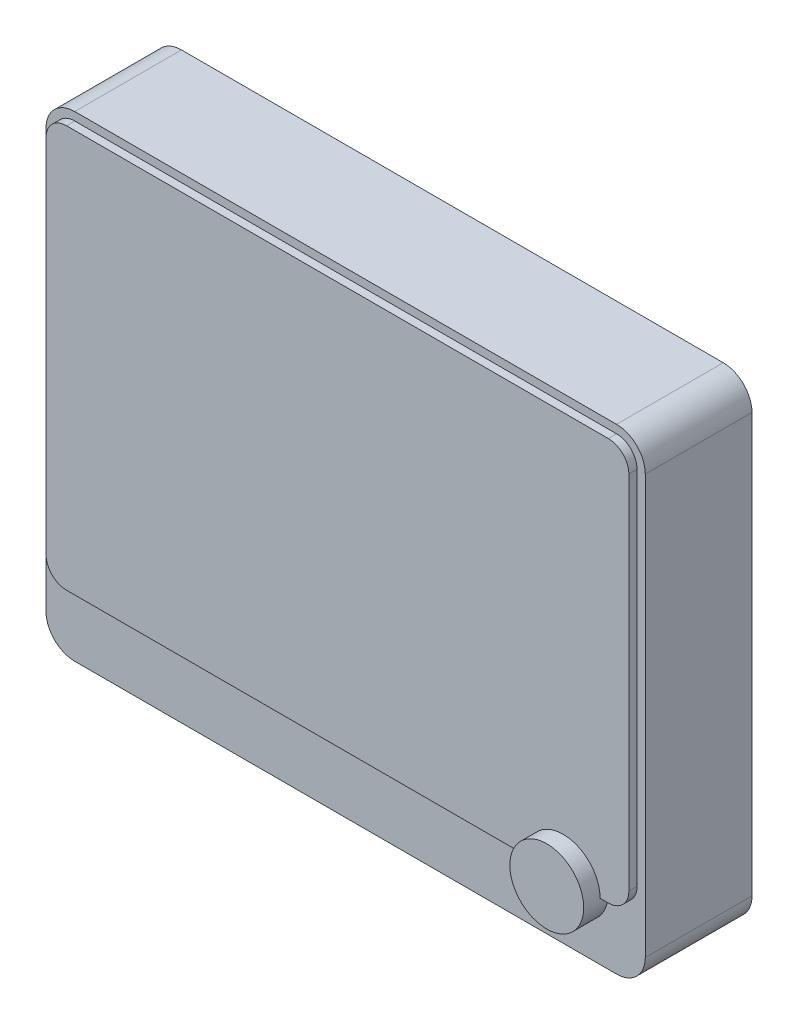
ISO-10303-21;
HEADER;
FILE_DESCRIPTION(('STEP AP214'),'2;1');
FILE_NAME('part.step','',(''),(''),'','','');
FILE_SCHEMA(('AUTOMOTIVE_DESIGN { 1 0 10303 214 1 1 1 1 }'));
ENDSEC;
DATA;
#1=APPLICATION_CONTEXT('core data for automotive mechanical design processes');
#2=APPLICATION_PROTOCOL_DEFINITION('international standard','automotive_design',2000,#1);
#3=PRODUCT_CONTEXT('',#1,'mechanical');
#4=PRODUCT('Part','Part','',(#3));
#5=PRODUCT_RELATED_PRODUCT_CATEGORY('part','',(#4));
#6=PRODUCT_DEFINITION_FORMATION('','',#4);
#7=PRODUCT_DEFINITION_CONTEXT('part definition',#1,'design');
#8=PRODUCT_DEFINITION('design','',#6,#7);
#9=PRODUCT_DEFINITION_SHAPE('','',#8);
#10=(LENGTH_UNIT() NAMED_UNIT(*) SI_UNIT(.MILLI.,.METRE.));
#11=(NAMED_UNIT(*) PLANE_ANGLE_UNIT() SI_UNIT($,.RADIAN.));
#12=(NAMED_UNIT(*) SI_UNIT($,.STERADIAN.) SOLID_ANGLE_UNIT());
#13=UNCERTAINTY_MEASURE_WITH_UNIT(LENGTH_MEASURE(1.E-05),#10,'distance_accuracy_value','');
#14=(GEOMETRIC_REPRESENTATION_CONTEXT(3) GLOBAL_UNCERTAINTY_ASSIGNED_CONTEXT((#13)) GLOBAL_UNIT_ASSIGNED_CONTEXT((#10,
#11,#12)) REPRESENTATION_CONTEXT('',''));
#15=CARTESIAN_POINT('',(0.,0.,0.));
#16=DIRECTION('',(0.,0.,1.));
#17=DIRECTION('',(1.,0.,0.));
#18=AXIS2_PLACEMENT_3D('',#15,#16,#17);
#19=CARTESIAN_POINT('',(3.5,8.,14.));
#20=DIRECTION('',(0.,1.,0.));
#21=DIRECTION('',(0.,0.,1.));
#22=AXIS2_PLACEMENT_3D('',#19,#20,#21);
#23=PLANE('',#22);
#24=DIRECTION('',(0.,0.,-1.));
#25=VECTOR('',#24,1.);
#26=CARTESIAN_POINT('',(68.5,8.,16.));
#27=LINE('',#26,#25);
#28=CARTESIAN_POINT('',(68.5,8.,13.));
#29=VERTEX_POINT('',#28);
#30=CARTESIAN_POINT('',(68.5,8.,14.));
#31=VERTEX_POINT('',#30);
#32=EDGE_CURVE('E56',#29,#31,#27,.F.);
#33=ORIENTED_EDGE('',*,*,#32,.F.);
#34=DIRECTION('',(1.,0.,0.));
#35=VECTOR('',#34,1.);
#36=CARTESIAN_POINT('',(3.5,8.,13.));
#37=LINE('',#36,#35);
#38=CARTESIAN_POINT('',(69.5,8.00000000000001,13.));
#39=VERTEX_POINT('',#38);
#40=EDGE_CURVE('E251',#29,#39,#37,.T.);
#41=ORIENTED_EDGE('',*,*,#40,.T.);
#42=DIRECTION('',(0.,0.,-1.));
#43=VECTOR('',#42,1.);
#44=CARTESIAN_POINT('',(69.5,8.00000000000001,14.));
#45=LINE('',#44,#43);
#46=CARTESIAN_POINT('',(69.5,8.00000000000001,14.));
#47=VERTEX_POINT('',#46);
#48=EDGE_CURVE('E283',#47,#39,#45,.T.);
#49=ORIENTED_EDGE('',*,*,#48,.F.);
#50=DIRECTION('',(1.,0.,0.));
#51=VECTOR('',#50,1.);
#52=CARTESIAN_POINT('',(3.5,8.,14.));
#53=LINE('',#52,#51);
#54=EDGE_CURVE('E231',#31,#47,#53,.T.);
#55=ORIENTED_EDGE('',*,*,#54,.F.);
#56=EDGE_LOOP('',(#33,#41,#49,#55));
#57=FACE_BOUND('',#56,.T.);
#58=ADVANCED_FACE('F33',(#57),#23,.F.);
#59=DIRECTION('',(0.,0.,-1.));
#60=VECTOR('',#59,1.);
#61=CARTESIAN_POINT('',(59.5,8.,16.));
#62=LINE('',#61,#60);
#63=CARTESIAN_POINT('',(59.5,8.,14.));
#64=VERTEX_POINT('',#63);
#65=CARTESIAN_POINT('',(59.5,8.,13.));
#66=VERTEX_POINT('',#65);
#67=EDGE_CURVE('E223',#64,#66,#62,.T.);
#68=ORIENTED_EDGE('',*,*,#67,.F.);
#69=CARTESIAN_POINT('',(3.5,8.,14.));
#70=VERTEX_POINT('',#69);
#71=EDGE_CURVE('E233',#70,#64,#53,.T.);
#72=ORIENTED_EDGE('',*,*,#71,.F.);
#73=DIRECTION('',(0.,0.,-1.));
#74=VECTOR('',#73,1.);
#75=CARTESIAN_POINT('',(3.5,8.,14.));
#76=LINE('',#75,#74);
#77=CARTESIAN_POINT('',(3.5,8.,13.));
#78=VERTEX_POINT('',#77);
#79=EDGE_CURVE('E286',#70,#78,#76,.T.);
#80=ORIENTED_EDGE('',*,*,#79,.T.);
#81=EDGE_CURVE('E252',#78,#66,#37,.T.);
#82=ORIENTED_EDGE('',*,*,#81,.T.);
#83=EDGE_LOOP('',(#68,#72,#80,#82));
#84=FACE_BOUND('',#83,.T.);
#85=ADVANCED_FACE('F395',(#84),#23,.F.);
#86=CARTESIAN_POINT('',(0.,0.,13.));
#87=DIRECTION('',(0.,0.,1.));
#88=DIRECTION('',(1.,0.,0.));
#89=AXIS2_PLACEMENT_3D('',#86,#87,#88);
#90=PLANE('',#89);
#91=DIRECTION('',(1.,0.,0.));
#92=VECTOR('',#91,1.);
#93=CARTESIAN_POINT('',(0.,0.,13.));
#94=LINE('',#93,#92);
#95=CARTESIAN_POINT('',(3.5,0.,13.));
#96=VERTEX_POINT('',#95);
#97=CARTESIAN_POINT('',(69.5,0.,13.));
#98=VERTEX_POINT('',#97);
#99=EDGE_CURVE('E292',#96,#98,#94,.T.);
#100=ORIENTED_EDGE('',*,*,#99,.T.);
#101=CARTESIAN_POINT('',(69.5,3.5,13.));
#102=DIRECTION('',(0.,0.,1.));
#103=DIRECTION('',(1.,0.,0.));
#104=AXIS2_PLACEMENT_3D('',#101,#102,#103);
#105=CIRCLE('',#104,3.5);
#106=CARTESIAN_POINT('',(73.,3.5,13.));
#107=VERTEX_POINT('',#106);
#108=EDGE_CURVE('E336',#98,#107,#105,.T.);
#109=ORIENTED_EDGE('',*,*,#108,.T.);
#110=DIRECTION('',(0.,1.,0.));
#111=VECTOR('',#110,1.);
#112=CARTESIAN_POINT('',(73.,0.,13.));
#113=LINE('',#112,#111);
#114=CARTESIAN_POINT('',(73.,54.5,13.));
#115=VERTEX_POINT('',#114);
#116=EDGE_CURVE('E296',#107,#115,#113,.T.);
#117=ORIENTED_EDGE('',*,*,#116,.T.);
#118=CARTESIAN_POINT('',(69.5,54.5,13.));
#119=DIRECTION('',(0.,0.,1.));
#120=DIRECTION('',(1.,0.,0.));
#121=AXIS2_PLACEMENT_3D('',#118,#119,#120);
#122=CIRCLE('',#121,3.5);
#123=CARTESIAN_POINT('',(69.5,58.,13.));
#124=VERTEX_POINT('',#123);
#125=EDGE_CURVE('E330',#115,#124,#122,.T.);
#126=ORIENTED_EDGE('',*,*,#125,.T.);
#127=DIRECTION('',(-1.,0.,0.));
#128=VECTOR('',#127,1.);
#129=CARTESIAN_POINT('',(73.,58.,13.));
#130=LINE('',#129,#128);
#131=CARTESIAN_POINT('',(3.5,58.,13.));
#132=VERTEX_POINT('',#131);
#133=EDGE_CURVE('E299',#124,#132,#130,.T.);
#134=ORIENTED_EDGE('',*,*,#133,.T.);
#135=CARTESIAN_POINT('',(3.5,54.5,13.));
#136=DIRECTION('',(0.,0.,1.));
#137=DIRECTION('',(1.,0.,0.));
#138=AXIS2_PLACEMENT_3D('',#135,#136,#137);
#139=CIRCLE('',#138,3.5);
#140=CARTESIAN_POINT('',(0.,54.5,13.));
#141=VERTEX_POINT('',#140);
#142=EDGE_CURVE('E332',#132,#141,#139,.T.);
#143=ORIENTED_EDGE('',*,*,#142,.T.);
#144=DIRECTION('',(0.,-1.,0.));
#145=VECTOR('',#144,1.);
#146=CARTESIAN_POINT('',(0.,58.,13.));
#147=LINE('',#146,#145);
#148=CARTESIAN_POINT('',(0.,3.50000000000001,13.));
#149=VERTEX_POINT('',#148);
#150=EDGE_CURVE('E289',#141,#149,#147,.T.);
#151=ORIENTED_EDGE('',*,*,#150,.T.);
#152=CARTESIAN_POINT('',(3.5,3.5,13.));
#153=DIRECTION('',(0.,0.,1.));
#154=DIRECTION('',(1.,0.,0.));
#155=AXIS2_PLACEMENT_3D('',#152,#153,#154);
#156=CIRCLE('',#155,3.5);
#157=EDGE_CURVE('E334',#149,#96,#156,.T.);
#158=ORIENTED_EDGE('',*,*,#157,.T.);
#159=EDGE_LOOP('',(#100,#109,#117,#126,#134,#143,#151,#158));
#160=FACE_BOUND('',#159,.T.);
#161=ORIENTED_EDGE('',*,*,#40,.F.);
#162=CARTESIAN_POINT('',(64.,8.,13.));
#163=DIRECTION('',(0.,0.,1.));
#164=DIRECTION('',(1.,0.,0.));
#165=AXIS2_PLACEMENT_3D('',#162,#163,#164);
#166=CIRCLE('',#165,4.5);
#167=EDGE_CURVE('E216',#66,#29,#166,.T.);
#168=ORIENTED_EDGE('',*,*,#167,.F.);
#169=ORIENTED_EDGE('',*,*,#81,.F.);
#170=CARTESIAN_POINT('',(3.5,10.5,13.));
#171=DIRECTION('',(0.,0.,1.));
#172=DIRECTION('',(1.,0.,0.));
#173=AXIS2_PLACEMENT_3D('',#170,#171,#172);
#174=CIRCLE('',#173,2.5);
#175=CARTESIAN_POINT('',(1.,10.5,13.));
#176=VERTEX_POINT('',#175);
#177=EDGE_CURVE('E227',#176,#78,#174,.T.);
#178=ORIENTED_EDGE('',*,*,#177,.F.);
#179=DIRECTION('',(0.,-1.,0.));
#180=VECTOR('',#179,1.);
#181=CARTESIAN_POINT('',(1.,54.5,13.));
#182=LINE('',#181,#180);
#183=CARTESIAN_POINT('',(1.,54.5,13.));
#184=VERTEX_POINT('',#183);
#185=EDGE_CURVE('E232',#184,#176,#182,.T.);
#186=ORIENTED_EDGE('',*,*,#185,.F.);
#187=CARTESIAN_POINT('',(3.5,54.5,13.));
#188=DIRECTION('',(0.,0.,1.));
#189=DIRECTION('',(1.,0.,0.));
#190=AXIS2_PLACEMENT_3D('',#187,#188,#189);
#191=CIRCLE('',#190,2.5);
#192=CARTESIAN_POINT('',(3.5,57.,13.));
#193=VERTEX_POINT('',#192);
#194=EDGE_CURVE('E263',#193,#184,#191,.T.);
#195=ORIENTED_EDGE('',*,*,#194,.F.);
#196=DIRECTION('',(-1.,0.,0.));
#197=VECTOR('',#196,1.);
#198=CARTESIAN_POINT('',(69.5,57.,13.));
#199=LINE('',#198,#197);
#200=CARTESIAN_POINT('',(69.5,57.,13.));
#201=VERTEX_POINT('',#200);
#202=EDGE_CURVE('E261',#201,#193,#199,.T.);
#203=ORIENTED_EDGE('',*,*,#202,.F.);
#204=CARTESIAN_POINT('',(69.5,54.5,13.));
#205=DIRECTION('',(0.,0.,1.));
#206=DIRECTION('',(1.,0.,0.));
#207=AXIS2_PLACEMENT_3D('',#204,#205,#206);
#208=CIRCLE('',#207,2.5);
#209=CARTESIAN_POINT('',(72.,54.5,13.));
#210=VERTEX_POINT('',#209);
#211=EDGE_CURVE('E259',#210,#201,#208,.T.);
#212=ORIENTED_EDGE('',*,*,#211,.F.);
#213=DIRECTION('',(0.,1.,0.));
#214=VECTOR('',#213,1.);
#215=CARTESIAN_POINT('',(72.,10.5,13.));
#216=LINE('',#215,#214);
#217=CARTESIAN_POINT('',(72.,10.5,13.));
#218=VERTEX_POINT('',#217);
#219=EDGE_CURVE('E257',#218,#210,#216,.T.);
#220=ORIENTED_EDGE('',*,*,#219,.F.);
#221=CARTESIAN_POINT('',(69.5,10.5,13.));
#222=DIRECTION('',(0.,0.,1.));
#223=DIRECTION('',(-1.,0.,0.));
#224=AXIS2_PLACEMENT_3D('',#221,#222,#223);
#225=CIRCLE('',#224,2.49999999999999);
#226=EDGE_CURVE('E255',#39,#218,#225,.T.);
#227=ORIENTED_EDGE('',*,*,#226,.F.);
#228=EDGE_LOOP('',(#161,#168,#169,#178,#186,#195,#203,#212,#220,#227));
#229=FACE_BOUND('',#228,.T.);
#230=ADVANCED_FACE('F354',(#160,#229),#90,.T.);
#231=CARTESIAN_POINT('',(0.,58.,13.));
#232=DIRECTION('',(1.,0.,0.));
#233=DIRECTION('',(0.,0.,-1.));
#234=AXIS2_PLACEMENT_3D('',#231,#232,#233);
#235=PLANE('',#234);
#236=DIRECTION('',(0.,-1.,0.));
#237=VECTOR('',#236,1.);
#238=CARTESIAN_POINT('',(0.,58.,0.));
#239=LINE('',#238,#237);
#240=CARTESIAN_POINT('',(0.,54.5,0.));
#241=VERTEX_POINT('',#240);
#242=CARTESIAN_POINT('',(0.,3.50000000000001,0.));
#243=VERTEX_POINT('',#242);
#244=EDGE_CURVE('E288',#241,#243,#239,.T.);
#245=ORIENTED_EDGE('',*,*,#244,.T.);
#246=DIRECTION('',(0.,0.,-1.));
#247=VECTOR('',#246,1.);
#248=CARTESIAN_POINT('',(0.,3.5,13.));
#249=LINE('',#248,#247);
#250=EDGE_CURVE('E341',#243,#149,#249,.F.);
#251=ORIENTED_EDGE('',*,*,#250,.T.);
#252=ORIENTED_EDGE('',*,*,#150,.F.);
#253=DIRECTION('',(0.,0.,-1.));
#254=VECTOR('',#253,1.);
#255=CARTESIAN_POINT('',(0.,54.5,13.));
#256=LINE('',#255,#254);
#257=EDGE_CURVE('E338',#141,#241,#256,.T.);
#258=ORIENTED_EDGE('',*,*,#257,.T.);
#259=EDGE_LOOP('',(#245,#251,#252,#258));
#260=FACE_BOUND('',#259,.T.);
#261=ADVANCED_FACE('F362',(#260),#235,.F.);
#262=CARTESIAN_POINT('',(0.,0.,13.));
#263=DIRECTION('',(0.,1.,0.));
#264=DIRECTION('',(0.,0.,1.));
#265=AXIS2_PLACEMENT_3D('',#262,#263,#264);
#266=PLANE('',#265);
#267=DIRECTION('',(1.,0.,0.));
#268=VECTOR('',#267,1.);
#269=CARTESIAN_POINT('',(0.,0.,0.));
#270=LINE('',#269,#268);
#271=CARTESIAN_POINT('',(3.5,0.,0.));
#272=VERTEX_POINT('',#271);
#273=CARTESIAN_POINT('',(69.5,0.,0.));
#274=VERTEX_POINT('',#273);
#275=EDGE_CURVE('E305',#272,#274,#270,.T.);
#276=ORIENTED_EDGE('',*,*,#275,.T.);
#277=DIRECTION('',(0.,0.,-1.));
#278=VECTOR('',#277,1.);
#279=CARTESIAN_POINT('',(69.5,0.,13.));
#280=LINE('',#279,#278);
#281=EDGE_CURVE('E328',#274,#98,#280,.F.);
#282=ORIENTED_EDGE('',*,*,#281,.T.);
#283=ORIENTED_EDGE('',*,*,#99,.F.);
#284=DIRECTION('',(0.,0.,-1.));
#285=VECTOR('',#284,1.);
#286=CARTESIAN_POINT('',(3.5,0.,13.));
#287=LINE('',#286,#285);
#288=EDGE_CURVE('E325',#96,#272,#287,.T.);
#289=ORIENTED_EDGE('',*,*,#288,.T.);
#290=EDGE_LOOP('',(#276,#282,#283,#289));
#291=FACE_BOUND('',#290,.T.);
#292=ADVANCED_FACE('F374',(#291),#266,.F.);
#293=CARTESIAN_POINT('',(73.,0.,13.));
#294=DIRECTION('',(-1.,0.,0.));
#295=DIRECTION('',(0.,0.,1.));
#296=AXIS2_PLACEMENT_3D('',#293,#294,#295);
#297=PLANE('',#296);
#298=ORIENTED_EDGE('',*,*,#116,.F.);
#299=DIRECTION('',(0.,0.,-1.));
#300=VECTOR('',#299,1.);
#301=CARTESIAN_POINT('',(73.,3.5,13.));
#302=LINE('',#301,#300);
#303=CARTESIAN_POINT('',(73.,3.5,0.));
#304=VERTEX_POINT('',#303);
#305=EDGE_CURVE('E314',#107,#304,#302,.T.);
#306=ORIENTED_EDGE('',*,*,#305,.T.);
#307=DIRECTION('',(0.,1.,0.));
#308=VECTOR('',#307,1.);
#309=CARTESIAN_POINT('',(73.,0.,0.));
#310=LINE('',#309,#308);
#311=CARTESIAN_POINT('',(73.,54.5,0.));
#312=VERTEX_POINT('',#311);
#313=EDGE_CURVE('E308',#304,#312,#310,.T.);
#314=ORIENTED_EDGE('',*,*,#313,.T.);
#315=DIRECTION('',(0.,0.,-1.));
#316=VECTOR('',#315,1.);
#317=CARTESIAN_POINT('',(73.,54.5,13.));
#318=LINE('',#317,#316);
#319=EDGE_CURVE('E302',#312,#115,#318,.F.);
#320=ORIENTED_EDGE('',*,*,#319,.T.);
#321=EDGE_LOOP('',(#298,#306,#314,#320));
#322=FACE_BOUND('',#321,.T.);
#323=ADVANCED_FACE('F382',(#322),#297,.F.);
#324=CARTESIAN_POINT('',(73.,58.,13.));
#325=DIRECTION('',(0.,-1.,0.));
#326=DIRECTION('',(0.,0.,-1.));
#327=AXIS2_PLACEMENT_3D('',#324,#325,#326);
#328=PLANE('',#327);
#329=DIRECTION('',(-1.,0.,0.));
#330=VECTOR('',#329,1.);
#331=CARTESIAN_POINT('',(73.,58.,0.));
#332=LINE('',#331,#330);
#333=CARTESIAN_POINT('',(69.5,58.,0.));
#334=VERTEX_POINT('',#333);
#335=CARTESIAN_POINT('',(3.5,58.,0.));
#336=VERTEX_POINT('',#335);
#337=EDGE_CURVE('E293',#334,#336,#332,.T.);
#338=ORIENTED_EDGE('',*,*,#337,.T.);
#339=DIRECTION('',(0.,0.,-1.));
#340=VECTOR('',#339,1.);
#341=CARTESIAN_POINT('',(3.5,58.,13.));
#342=LINE('',#341,#340);
#343=EDGE_CURVE('E41',#336,#132,#342,.F.);
#344=ORIENTED_EDGE('',*,*,#343,.T.);
#345=ORIENTED_EDGE('',*,*,#133,.F.);
#346=DIRECTION('',(0.,0.,-1.));
#347=VECTOR('',#346,1.);
#348=CARTESIAN_POINT('',(69.5,58.,13.));
#349=LINE('',#348,#347);
#350=EDGE_CURVE('E343',#124,#334,#349,.T.);
#351=ORIENTED_EDGE('',*,*,#350,.T.);
#352=EDGE_LOOP('',(#338,#344,#345,#351));
#353=FACE_BOUND('',#352,.T.);
#354=ADVANCED_FACE('F348',(#353),#328,.F.);
#355=CARTESIAN_POINT('',(0.,0.,0.));
#356=DIRECTION('',(0.,0.,1.));
#357=DIRECTION('',(1.,0.,0.));
#358=AXIS2_PLACEMENT_3D('',#355,#356,#357);
#359=PLANE('',#358);
#360=DIRECTION('',(-1.,0.,0.));
#361=VECTOR('',#360,1.);
#362=CARTESIAN_POINT('',(63.,42.,0.));
#363=LINE('',#362,#361);
#364=CARTESIAN_POINT('',(63.,42.,0.));
#365=VERTEX_POINT('',#364);
#366=CARTESIAN_POINT('',(9.99999999999999,42.,0.));
#367=VERTEX_POINT('',#366);
#368=EDGE_CURVE('E210',#365,#367,#363,.T.);
#369=ORIENTED_EDGE('',*,*,#368,.F.);
#370=DIRECTION('',(0.,-1.,0.));
#371=VECTOR('',#370,1.);
#372=CARTESIAN_POINT('',(63.,48.,0.));
#373=LINE('',#372,#371);
#374=CARTESIAN_POINT('',(63.,48.,0.));
#375=VERTEX_POINT('',#374);
#376=EDGE_CURVE('E48',#375,#365,#373,.T.);
#377=ORIENTED_EDGE('',*,*,#376,.F.);
#378=DIRECTION('',(1.,0.,0.));
#379=VECTOR('',#378,1.);
#380=CARTESIAN_POINT('',(63.,48.,0.));
#381=LINE('',#380,#379);
#382=CARTESIAN_POINT('',(9.99999999999999,48.,0.));
#383=VERTEX_POINT('',#382);
#384=EDGE_CURVE('E201',#383,#375,#381,.T.);
#385=ORIENTED_EDGE('',*,*,#384,.F.);
#386=DIRECTION('',(0.,1.,0.));
#387=VECTOR('',#386,1.);
#388=CARTESIAN_POINT('',(9.99999999999999,48.,0.));
#389=LINE('',#388,#387);
#390=EDGE_CURVE('E204',#367,#383,#389,.T.);
#391=ORIENTED_EDGE('',*,*,#390,.F.);
#392=EDGE_LOOP('',(#369,#377,#385,#391));
#393=FACE_BOUND('',#392,.T.);
#394=ORIENTED_EDGE('',*,*,#313,.F.);
#395=CARTESIAN_POINT('',(69.5,3.5,0.));
#396=DIRECTION('',(0.,0.,1.));
#397=DIRECTION('',(1.,0.,0.));
#398=AXIS2_PLACEMENT_3D('',#395,#396,#397);
#399=CIRCLE('',#398,3.5);
#400=EDGE_CURVE('E323',#304,#274,#399,.F.);
#401=ORIENTED_EDGE('',*,*,#400,.T.);
#402=ORIENTED_EDGE('',*,*,#275,.F.);
#403=CARTESIAN_POINT('',(3.5,3.5,0.));
#404=DIRECTION('',(0.,0.,1.));
#405=DIRECTION('',(1.,0.,0.));
#406=AXIS2_PLACEMENT_3D('',#403,#404,#405);
#407=CIRCLE('',#406,3.5);
#408=EDGE_CURVE('E321',#272,#243,#407,.F.);
#409=ORIENTED_EDGE('',*,*,#408,.T.);
#410=ORIENTED_EDGE('',*,*,#244,.F.);
#411=CARTESIAN_POINT('',(3.5,54.5,0.));
#412=DIRECTION('',(0.,0.,1.));
#413=DIRECTION('',(1.,0.,0.));
#414=AXIS2_PLACEMENT_3D('',#411,#412,#413);
#415=CIRCLE('',#414,3.5);
#416=EDGE_CURVE('E319',#241,#336,#415,.F.);
#417=ORIENTED_EDGE('',*,*,#416,.T.);
#418=ORIENTED_EDGE('',*,*,#337,.F.);
#419=CARTESIAN_POINT('',(69.5,54.5,0.));
#420=DIRECTION('',(0.,0.,1.));
#421=DIRECTION('',(1.,0.,0.));
#422=AXIS2_PLACEMENT_3D('',#419,#420,#421);
#423=CIRCLE('',#422,3.5);
#424=EDGE_CURVE('E317',#334,#312,#423,.F.);
#425=ORIENTED_EDGE('',*,*,#424,.T.);
#426=EDGE_LOOP('',(#394,#401,#402,#409,#410,#417,#418,#425));
#427=FACE_BOUND('',#426,.T.);
#428=ADVANCED_FACE('F366',(#393,#427),#359,.F.);
#429=CARTESIAN_POINT('',(69.5,3.5,13.));
#430=DIRECTION('',(0.,0.,-1.));
#431=DIRECTION('',(-1.,0.,0.));
#432=AXIS2_PLACEMENT_3D('',#429,#430,#431);
#433=CYLINDRICAL_SURFACE('',#432,3.5);
#434=ORIENTED_EDGE('',*,*,#108,.F.);
#435=ORIENTED_EDGE('',*,*,#281,.F.);
#436=ORIENTED_EDGE('',*,*,#400,.F.);
#437=ORIENTED_EDGE('',*,*,#305,.F.);
#438=EDGE_LOOP('',(#434,#435,#436,#437));
#439=FACE_BOUND('',#438,.T.);
#440=ADVANCED_FACE('F380',(#439),#433,.T.);
#441=CARTESIAN_POINT('',(3.5,3.5,13.));
#442=DIRECTION('',(0.,0.,-1.));
#443=DIRECTION('',(-1.,0.,0.));
#444=AXIS2_PLACEMENT_3D('',#441,#442,#443);
#445=CYLINDRICAL_SURFACE('',#444,3.5);
#446=ORIENTED_EDGE('',*,*,#157,.F.);
#447=ORIENTED_EDGE('',*,*,#250,.F.);
#448=ORIENTED_EDGE('',*,*,#408,.F.);
#449=ORIENTED_EDGE('',*,*,#288,.F.);
#450=EDGE_LOOP('',(#446,#447,#448,#449));
#451=FACE_BOUND('',#450,.T.);
#452=ADVANCED_FACE('F371',(#451),#445,.T.);
#453=CARTESIAN_POINT('',(3.5,54.5,13.));
#454=DIRECTION('',(0.,0.,-1.));
#455=DIRECTION('',(-1.,0.,0.));
#456=AXIS2_PLACEMENT_3D('',#453,#454,#455);
#457=CYLINDRICAL_SURFACE('',#456,3.5);
#458=ORIENTED_EDGE('',*,*,#142,.F.);
#459=ORIENTED_EDGE('',*,*,#343,.F.);
#460=ORIENTED_EDGE('',*,*,#416,.F.);
#461=ORIENTED_EDGE('',*,*,#257,.F.);
#462=EDGE_LOOP('',(#458,#459,#460,#461));
#463=FACE_BOUND('',#462,.T.);
#464=ADVANCED_FACE('F359',(#463),#457,.T.);
#465=CARTESIAN_POINT('',(69.5,54.5,13.));
#466=DIRECTION('',(0.,0.,-1.));
#467=DIRECTION('',(-1.,0.,0.));
#468=AXIS2_PLACEMENT_3D('',#465,#466,#467);
#469=CYLINDRICAL_SURFACE('',#468,3.5);
#470=ORIENTED_EDGE('',*,*,#125,.F.);
#471=ORIENTED_EDGE('',*,*,#319,.F.);
#472=ORIENTED_EDGE('',*,*,#424,.F.);
#473=ORIENTED_EDGE('',*,*,#350,.F.);
#474=EDGE_LOOP('',(#470,#471,#472,#473));
#475=FACE_BOUND('',#474,.T.);
#476=ADVANCED_FACE('F35',(#475),#469,.T.);
#477=CARTESIAN_POINT('',(3.5,10.5,14.));
#478=DIRECTION('',(0.,0.,-1.));
#479=DIRECTION('',(-1.,0.,0.));
#480=AXIS2_PLACEMENT_3D('',#477,#478,#479);
#481=CYLINDRICAL_SURFACE('',#480,2.5);
#482=ORIENTED_EDGE('',*,*,#177,.T.);
#483=ORIENTED_EDGE('',*,*,#79,.F.);
#484=CARTESIAN_POINT('',(3.5,10.5,14.));
#485=DIRECTION('',(0.,0.,1.));
#486=DIRECTION('',(1.,0.,0.));
#487=AXIS2_PLACEMENT_3D('',#484,#485,#486);
#488=CIRCLE('',#487,2.5);
#489=CARTESIAN_POINT('',(1.,10.5,14.));
#490=VERTEX_POINT('',#489);
#491=EDGE_CURVE('E228',#490,#70,#488,.T.);
#492=ORIENTED_EDGE('',*,*,#491,.F.);
#493=DIRECTION('',(0.,0.,-1.));
#494=VECTOR('',#493,1.);
#495=CARTESIAN_POINT('',(1.,10.5,14.));
#496=LINE('',#495,#494);
#497=EDGE_CURVE('E248',#490,#176,#496,.T.);
#498=ORIENTED_EDGE('',*,*,#497,.T.);
#499=EDGE_LOOP('',(#482,#483,#492,#498));
#500=FACE_BOUND('',#499,.T.);
#501=ADVANCED_FACE('F386',(#500),#481,.T.);
#502=CARTESIAN_POINT('',(69.5,10.5,14.));
#503=DIRECTION('',(0.,0.,-1.));
#504=DIRECTION('',(-1.,0.,0.));
#505=AXIS2_PLACEMENT_3D('',#502,#503,#504);
#506=CYLINDRICAL_SURFACE('',#505,2.49999999999999);
#507=ORIENTED_EDGE('',*,*,#226,.T.);
#508=DIRECTION('',(0.,0.,-1.));
#509=VECTOR('',#508,1.);
#510=CARTESIAN_POINT('',(72.,10.5,14.));
#511=LINE('',#510,#509);
#512=CARTESIAN_POINT('',(72.,10.5,14.));
#513=VERTEX_POINT('',#512);
#514=EDGE_CURVE('E280',#513,#218,#511,.T.);
#515=ORIENTED_EDGE('',*,*,#514,.F.);
#516=CARTESIAN_POINT('',(69.5,10.5,14.));
#517=DIRECTION('',(0.,0.,1.));
#518=DIRECTION('',(-1.,0.,0.));
#519=AXIS2_PLACEMENT_3D('',#516,#517,#518);
#520=CIRCLE('',#519,2.49999999999999);
#521=EDGE_CURVE('E236',#47,#513,#520,.T.);
#522=ORIENTED_EDGE('',*,*,#521,.F.);
#523=ORIENTED_EDGE('',*,*,#48,.T.);
#524=EDGE_LOOP('',(#507,#515,#522,#523));
#525=FACE_BOUND('',#524,.T.);
#526=ADVANCED_FACE('F391',(#525),#506,.T.);
#527=CARTESIAN_POINT('',(72.,10.5,14.));
#528=DIRECTION('',(-1.,0.,0.));
#529=DIRECTION('',(0.,0.,1.));
#530=AXIS2_PLACEMENT_3D('',#527,#528,#529);
#531=PLANE('',#530);
#532=ORIENTED_EDGE('',*,*,#219,.T.);
#533=DIRECTION('',(0.,0.,-1.));
#534=VECTOR('',#533,1.);
#535=CARTESIAN_POINT('',(72.,54.5,14.));
#536=LINE('',#535,#534);
#537=CARTESIAN_POINT('',(72.,54.5,14.));
#538=VERTEX_POINT('',#537);
#539=EDGE_CURVE('E277',#538,#210,#536,.T.);
#540=ORIENTED_EDGE('',*,*,#539,.F.);
#541=DIRECTION('',(0.,1.,0.));
#542=VECTOR('',#541,1.);
#543=CARTESIAN_POINT('',(72.,10.5,14.));
#544=LINE('',#543,#542);
#545=EDGE_CURVE('E238',#513,#538,#544,.T.);
#546=ORIENTED_EDGE('',*,*,#545,.F.);
#547=ORIENTED_EDGE('',*,*,#514,.T.);
#548=EDGE_LOOP('',(#532,#540,#546,#547));
#549=FACE_BOUND('',#548,.T.);
#550=ADVANCED_FACE('F449',(#549),#531,.F.);
#551=CARTESIAN_POINT('',(69.5,54.5,14.));
#552=DIRECTION('',(0.,0.,-1.));
#553=DIRECTION('',(-1.,0.,0.));
#554=AXIS2_PLACEMENT_3D('',#551,#552,#553);
#555=CYLINDRICAL_SURFACE('',#554,2.5);
#556=ORIENTED_EDGE('',*,*,#211,.T.);
#557=DIRECTION('',(0.,0.,-1.));
#558=VECTOR('',#557,1.);
#559=CARTESIAN_POINT('',(69.5,57.,14.));
#560=LINE('',#559,#558);
#561=CARTESIAN_POINT('',(69.5,57.,14.));
#562=VERTEX_POINT('',#561);
#563=EDGE_CURVE('E274',#562,#201,#560,.T.);
#564=ORIENTED_EDGE('',*,*,#563,.F.);
#565=CARTESIAN_POINT('',(69.5,54.5,14.));
#566=DIRECTION('',(0.,0.,1.));
#567=DIRECTION('',(1.,0.,0.));
#568=AXIS2_PLACEMENT_3D('',#565,#566,#567);
#569=CIRCLE('',#568,2.5);
#570=EDGE_CURVE('E240',#538,#562,#569,.T.);
#571=ORIENTED_EDGE('',*,*,#570,.F.);
#572=ORIENTED_EDGE('',*,*,#539,.T.);
#573=EDGE_LOOP('',(#556,#564,#571,#572));
#574=FACE_BOUND('',#573,.T.);
#575=ADVANCED_FACE('F458',(#574),#555,.T.);
#576=CARTESIAN_POINT('',(69.5,57.,14.));
#577=DIRECTION('',(0.,-1.,0.));
#578=DIRECTION('',(1.,0.,0.));
#579=AXIS2_PLACEMENT_3D('',#576,#577,#578);
#580=PLANE('',#579);
#581=ORIENTED_EDGE('',*,*,#202,.T.);
#582=DIRECTION('',(0.,0.,-1.));
#583=VECTOR('',#582,1.);
#584=CARTESIAN_POINT('',(3.5,57.,14.));
#585=LINE('',#584,#583);
#586=CARTESIAN_POINT('',(3.5,57.,14.));
#587=VERTEX_POINT('',#586);
#588=EDGE_CURVE('E271',#587,#193,#585,.T.);
#589=ORIENTED_EDGE('',*,*,#588,.F.);
#590=DIRECTION('',(-1.,0.,0.));
#591=VECTOR('',#590,1.);
#592=CARTESIAN_POINT('',(69.5,57.,14.));
#593=LINE('',#592,#591);
#594=EDGE_CURVE('E242',#562,#587,#593,.T.);
#595=ORIENTED_EDGE('',*,*,#594,.F.);
#596=ORIENTED_EDGE('',*,*,#563,.T.);
#597=EDGE_LOOP('',(#581,#589,#595,#596));
#598=FACE_BOUND('',#597,.T.);
#599=ADVANCED_FACE('F467',(#598),#580,.F.);
#600=CARTESIAN_POINT('',(3.5,54.5,14.));
#601=DIRECTION('',(0.,0.,-1.));
#602=DIRECTION('',(-1.,0.,0.));
#603=AXIS2_PLACEMENT_3D('',#600,#601,#602);
#604=CYLINDRICAL_SURFACE('',#603,2.5);
#605=ORIENTED_EDGE('',*,*,#194,.T.);
#606=DIRECTION('',(0.,0.,-1.));
#607=VECTOR('',#606,1.);
#608=CARTESIAN_POINT('',(1.,54.5,14.));
#609=LINE('',#608,#607);
#610=CARTESIAN_POINT('',(1.,54.5,14.));
#611=VERTEX_POINT('',#610);
#612=EDGE_CURVE('E269',#611,#184,#609,.T.);
#613=ORIENTED_EDGE('',*,*,#612,.F.);
#614=CARTESIAN_POINT('',(3.5,54.5,14.));
#615=DIRECTION('',(0.,0.,1.));
#616=DIRECTION('',(1.,0.,0.));
#617=AXIS2_PLACEMENT_3D('',#614,#615,#616);
#618=CIRCLE('',#617,2.5);
#619=EDGE_CURVE('E244',#587,#611,#618,.T.);
#620=ORIENTED_EDGE('',*,*,#619,.F.);
#621=ORIENTED_EDGE('',*,*,#588,.T.);
#622=EDGE_LOOP('',(#605,#613,#620,#621));
#623=FACE_BOUND('',#622,.T.);
#624=ADVANCED_FACE('F477',(#623),#604,.T.);
#625=CARTESIAN_POINT('',(1.,54.5,14.));
#626=DIRECTION('',(1.,0.,0.));
#627=DIRECTION('',(0.,1.,0.));
#628=AXIS2_PLACEMENT_3D('',#625,#626,#627);
#629=PLANE('',#628);
#630=ORIENTED_EDGE('',*,*,#185,.T.);
#631=ORIENTED_EDGE('',*,*,#497,.F.);
#632=DIRECTION('',(0.,-1.,0.));
#633=VECTOR('',#632,1.);
#634=CARTESIAN_POINT('',(1.,54.5,14.));
#635=LINE('',#634,#633);
#636=EDGE_CURVE('E246',#611,#490,#635,.T.);
#637=ORIENTED_EDGE('',*,*,#636,.F.);
#638=ORIENTED_EDGE('',*,*,#612,.T.);
#639=EDGE_LOOP('',(#630,#631,#637,#638));
#640=FACE_BOUND('',#639,.T.);
#641=ADVANCED_FACE('F487',(#640),#629,.F.);
#642=CARTESIAN_POINT('',(3.5,10.5,14.));
#643=DIRECTION('',(0.,0.,1.));
#644=DIRECTION('',(1.,0.,0.));
#645=AXIS2_PLACEMENT_3D('',#642,#643,#644);
#646=PLANE('',#645);
#647=ORIENTED_EDGE('',*,*,#71,.T.);
#648=CARTESIAN_POINT('',(64.,8.,14.));
#649=DIRECTION('',(0.,0.,1.));
#650=DIRECTION('',(1.,0.,0.));
#651=AXIS2_PLACEMENT_3D('',#648,#649,#650);
#652=CIRCLE('',#651,4.5);
#653=EDGE_CURVE('E11',#64,#31,#652,.F.);
#654=ORIENTED_EDGE('',*,*,#653,.T.);
#655=ORIENTED_EDGE('',*,*,#54,.T.);
#656=ORIENTED_EDGE('',*,*,#521,.T.);
#657=ORIENTED_EDGE('',*,*,#545,.T.);
#658=ORIENTED_EDGE('',*,*,#570,.T.);
#659=ORIENTED_EDGE('',*,*,#594,.T.);
#660=ORIENTED_EDGE('',*,*,#619,.T.);
#661=ORIENTED_EDGE('',*,*,#636,.T.);
#662=ORIENTED_EDGE('',*,*,#491,.T.);
#663=EDGE_LOOP('',(#647,#654,#655,#656,#657,#658,#659,#660,#661,#662));
#664=FACE_BOUND('',#663,.T.);
#665=ADVANCED_FACE('F496',(#664),#646,.T.);
#666=CARTESIAN_POINT('',(64.,8.,16.));
#667=DIRECTION('',(0.,0.,-1.));
#668=DIRECTION('',(-1.,0.,0.));
#669=AXIS2_PLACEMENT_3D('',#666,#667,#668);
#670=CYLINDRICAL_SURFACE('',#669,4.5);
#671=CARTESIAN_POINT('',(64.,8.,16.));
#672=DIRECTION('',(0.,0.,1.));
#673=DIRECTION('',(1.,0.,0.));
#674=AXIS2_PLACEMENT_3D('',#671,#672,#673);
#675=CIRCLE('',#674,4.5);
#676=CARTESIAN_POINT('',(68.5,8.,16.));
#677=VERTEX_POINT('',#676);
#678=EDGE_CURVE('E220',#677,#677,#675,.T.);
#679=ORIENTED_EDGE('',*,*,#678,.F.);
#680=EDGE_LOOP('',(#679));
#681=FACE_BOUND('',#680,.T.);
#682=ORIENTED_EDGE('',*,*,#167,.T.);
#683=ORIENTED_EDGE('',*,*,#32,.T.);
#684=ORIENTED_EDGE('',*,*,#653,.F.);
#685=ORIENTED_EDGE('',*,*,#67,.T.);
#686=EDGE_LOOP('',(#682,#683,#684,#685));
#687=FACE_BOUND('',#686,.T.);
#688=ADVANCED_FACE('F523',(#681,#687),#670,.T.);
#689=CARTESIAN_POINT('',(64.,8.,16.));
#690=DIRECTION('',(0.,0.,1.));
#691=DIRECTION('',(1.,0.,0.));
#692=AXIS2_PLACEMENT_3D('',#689,#690,#691);
#693=PLANE('',#692);
#694=ORIENTED_EDGE('',*,*,#678,.T.);
#695=EDGE_LOOP('',(#694));
#696=FACE_BOUND('',#695,.T.);
#697=ADVANCED_FACE('F532',(#696),#693,.T.);
#698=CARTESIAN_POINT('',(63.,48.,1.));
#699=DIRECTION('',(1.,0.,0.));
#700=DIRECTION('',(0.,0.,-1.));
#701=AXIS2_PLACEMENT_3D('',#698,#699,#700);
#702=PLANE('',#701);
#703=ORIENTED_EDGE('',*,*,#376,.T.);
#704=DIRECTION('',(0.,0.,-1.));
#705=VECTOR('',#704,1.);
#706=CARTESIAN_POINT('',(63.,42.,1.));
#707=LINE('',#706,#705);
#708=CARTESIAN_POINT('',(63.,42.,1.));
#709=VERTEX_POINT('',#708);
#710=EDGE_CURVE('E179',#709,#365,#707,.T.);
#711=ORIENTED_EDGE('',*,*,#710,.F.);
#712=DIRECTION('',(0.,-1.,0.));
#713=VECTOR('',#712,1.);
#714=CARTESIAN_POINT('',(63.,48.,1.));
#715=LINE('',#714,#713);
#716=CARTESIAN_POINT('',(63.,48.,1.));
#717=VERTEX_POINT('',#716);
#718=EDGE_CURVE('E183',#717,#709,#715,.T.);
#719=ORIENTED_EDGE('',*,*,#718,.F.);
#720=DIRECTION('',(0.,0.,-1.));
#721=VECTOR('',#720,1.);
#722=CARTESIAN_POINT('',(63.,48.,1.));
#723=LINE('',#722,#721);
#724=EDGE_CURVE('E214',#717,#375,#723,.T.);
#725=ORIENTED_EDGE('',*,*,#724,.T.);
#726=EDGE_LOOP('',(#703,#711,#719,#725));
#727=FACE_BOUND('',#726,.T.);
#728=ADVANCED_FACE('F181',(#727),#702,.F.);
#729=CARTESIAN_POINT('',(63.,48.,1.));
#730=DIRECTION('',(0.,1.,0.));
#731=DIRECTION('',(0.,0.,1.));
#732=AXIS2_PLACEMENT_3D('',#729,#730,#731);
#733=PLANE('',#732);
#734=ORIENTED_EDGE('',*,*,#384,.T.);
#735=ORIENTED_EDGE('',*,*,#724,.F.);
#736=DIRECTION('',(1.,0.,0.));
#737=VECTOR('',#736,1.);
#738=CARTESIAN_POINT('',(63.,48.,1.));
#739=LINE('',#738,#737);
#740=CARTESIAN_POINT('',(9.99999999999999,48.,1.));
#741=VERTEX_POINT('',#740);
#742=EDGE_CURVE('E189',#741,#717,#739,.T.);
#743=ORIENTED_EDGE('',*,*,#742,.F.);
#744=DIRECTION('',(0.,0.,-1.));
#745=VECTOR('',#744,1.);
#746=CARTESIAN_POINT('',(9.99999999999999,48.,1.));
#747=LINE('',#746,#745);
#748=EDGE_CURVE('E217',#741,#383,#747,.T.);
#749=ORIENTED_EDGE('',*,*,#748,.T.);
#750=EDGE_LOOP('',(#734,#735,#743,#749));
#751=FACE_BOUND('',#750,.T.);
#752=ADVANCED_FACE('F559',(#751),#733,.F.);
#753=CARTESIAN_POINT('',(9.99999999999999,48.,1.));
#754=DIRECTION('',(-1.,0.,0.));
#755=DIRECTION('',(0.,0.,1.));
#756=AXIS2_PLACEMENT_3D('',#753,#754,#755);
#757=PLANE('',#756);
#758=ORIENTED_EDGE('',*,*,#390,.T.);
#759=ORIENTED_EDGE('',*,*,#748,.F.);
#760=DIRECTION('',(0.,1.,0.));
#761=VECTOR('',#760,1.);
#762=CARTESIAN_POINT('',(9.99999999999999,48.,1.));
#763=LINE('',#762,#761);
#764=CARTESIAN_POINT('',(9.99999999999999,42.,1.));
#765=VERTEX_POINT('',#764);
#766=EDGE_CURVE('E197',#765,#741,#763,.T.);
#767=ORIENTED_EDGE('',*,*,#766,.F.);
#768=DIRECTION('',(0.,0.,-1.));
#769=VECTOR('',#768,1.);
#770=CARTESIAN_POINT('',(9.99999999999999,42.,1.));
#771=LINE('',#770,#769);
#772=EDGE_CURVE('E188',#765,#367,#771,.T.);
#773=ORIENTED_EDGE('',*,*,#772,.T.);
#774=EDGE_LOOP('',(#758,#759,#767,#773));
#775=FACE_BOUND('',#774,.T.);
#776=ADVANCED_FACE('F568',(#775),#757,.F.);
#777=CARTESIAN_POINT('',(63.,42.,1.));
#778=DIRECTION('',(0.,-1.,0.));
#779=DIRECTION('',(0.,0.,-1.));
#780=AXIS2_PLACEMENT_3D('',#777,#778,#779);
#781=PLANE('',#780);
#782=ORIENTED_EDGE('',*,*,#368,.T.);
#783=ORIENTED_EDGE('',*,*,#772,.F.);
#784=DIRECTION('',(-1.,0.,0.));
#785=VECTOR('',#784,1.);
#786=CARTESIAN_POINT('',(63.,42.,1.));
#787=LINE('',#786,#785);
#788=EDGE_CURVE('E192',#709,#765,#787,.T.);
#789=ORIENTED_EDGE('',*,*,#788,.F.);
#790=ORIENTED_EDGE('',*,*,#710,.T.);
#791=EDGE_LOOP('',(#782,#783,#789,#790));
#792=FACE_BOUND('',#791,.T.);
#793=ADVANCED_FACE('F193',(#792),#781,.F.);
#794=CARTESIAN_POINT('',(0.,0.,1.));
#795=DIRECTION('',(0.,0.,-1.));
#796=DIRECTION('',(-1.,0.,0.));
#797=AXIS2_PLACEMENT_3D('',#794,#795,#796);
#798=PLANE('',#797);
#799=ORIENTED_EDGE('',*,*,#718,.T.);
#800=ORIENTED_EDGE('',*,*,#788,.T.);
#801=ORIENTED_EDGE('',*,*,#766,.T.);
#802=ORIENTED_EDGE('',*,*,#742,.T.);
#803=EDGE_LOOP('',(#799,#800,#801,#802));
#804=FACE_BOUND('',#803,.T.);
#805=ADVANCED_FACE('F199',(#804),#798,.T.);
#806=CLOSED_SHELL('',(#58,#85,#230,#261,#292,#323,#354,#428,#440,#452,#464,#476,#501,#526,#550,
#575,#599,#624,#641,#665,#688,#697,#728,#752,#776,#793,#805));
#807=MANIFOLD_SOLID_BREP('B2',#806);
#808=ADVANCED_BREP_SHAPE_REPRESENTATION('',(#18,#807),#14);
#809=SHAPE_DEFINITION_REPRESENTATION(#9,#808);
ENDSEC;
END-ISO-10303-21;
